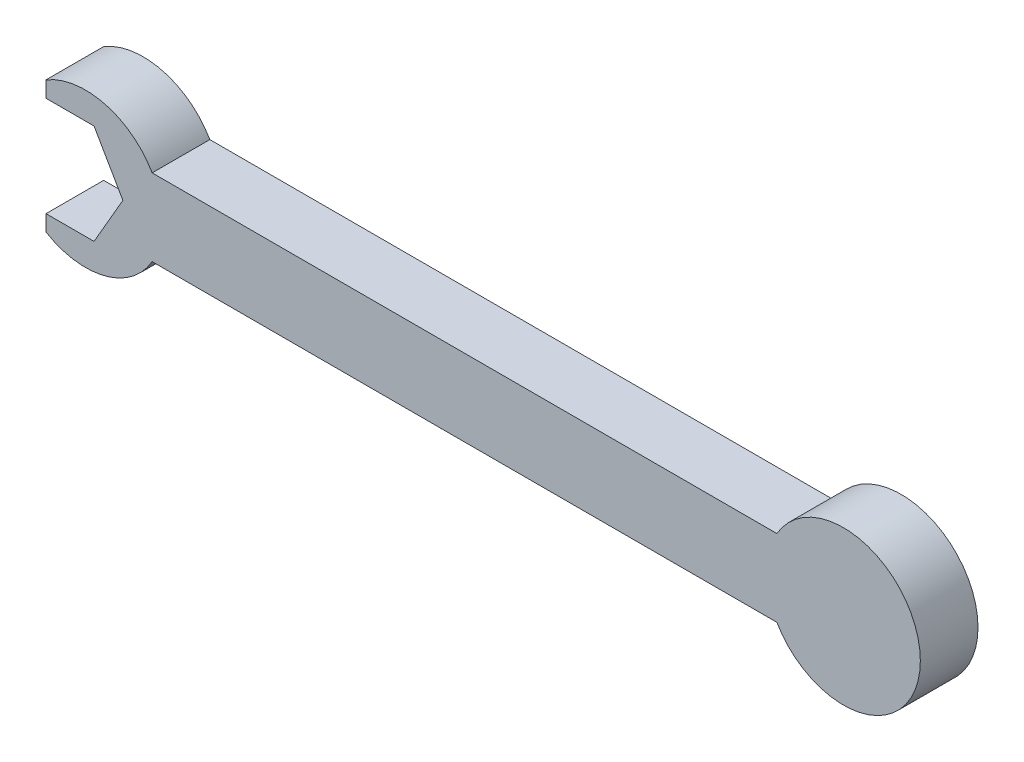
ISO-10303-21;
HEADER;
FILE_DESCRIPTION(('STEP AP214'),'2;1');
FILE_NAME('part.step','',(''),(''),'','','');
FILE_SCHEMA(('AUTOMOTIVE_DESIGN { 1 0 10303 214 1 1 1 1 }'));
ENDSEC;
DATA;
#1=APPLICATION_CONTEXT('core data for automotive mechanical design processes');
#2=APPLICATION_PROTOCOL_DEFINITION('international standard','automotive_design',2000,#1);
#3=PRODUCT_CONTEXT('',#1,'mechanical');
#4=PRODUCT('Part','Part','',(#3));
#5=PRODUCT_RELATED_PRODUCT_CATEGORY('part','',(#4));
#6=PRODUCT_DEFINITION_FORMATION('','',#4);
#7=PRODUCT_DEFINITION_CONTEXT('part definition',#1,'design');
#8=PRODUCT_DEFINITION('design','',#6,#7);
#9=PRODUCT_DEFINITION_SHAPE('','',#8);
#10=(LENGTH_UNIT() NAMED_UNIT(*) SI_UNIT(.MILLI.,.METRE.));
#11=(NAMED_UNIT(*) PLANE_ANGLE_UNIT() SI_UNIT($,.RADIAN.));
#12=(NAMED_UNIT(*) SI_UNIT($,.STERADIAN.) SOLID_ANGLE_UNIT());
#13=UNCERTAINTY_MEASURE_WITH_UNIT(LENGTH_MEASURE(1.E-05),#10,'distance_accuracy_value','');
#14=(GEOMETRIC_REPRESENTATION_CONTEXT(3) GLOBAL_UNCERTAINTY_ASSIGNED_CONTEXT((#13)) GLOBAL_UNIT_ASSIGNED_CONTEXT((#10,
#11,#12)) REPRESENTATION_CONTEXT('',''));
#15=CARTESIAN_POINT('',(0.,0.,0.));
#16=DIRECTION('',(0.,0.,1.));
#17=DIRECTION('',(1.,0.,0.));
#18=AXIS2_PLACEMENT_3D('',#15,#16,#17);
#19=CARTESIAN_POINT('',(0.,0.,3.81));
#20=DIRECTION('',(0.,0.,-1.));
#21=DIRECTION('',(-1.,0.,0.));
#22=AXIS2_PLACEMENT_3D('',#19,#20,#21);
#23=CYLINDRICAL_SURFACE('',#22,10.16);
#24=DIRECTION('',(0.,0.,1.));
#25=VECTOR('',#24,1.);
#26=CARTESIAN_POINT('',(-5.2310529809468,-8.70986134852488,-3.81));
#27=LINE('',#26,#25);
#28=CARTESIAN_POINT('',(-5.2310529809468,-8.70986134852488,-3.81));
#29=VERTEX_POINT('',#28);
#30=CARTESIAN_POINT('',(-5.2310529809468,-8.70986134852488,3.81));
#31=VERTEX_POINT('',#30);
#32=EDGE_CURVE('E150',#29,#31,#27,.T.);
#33=ORIENTED_EDGE('',*,*,#32,.F.);
#34=CARTESIAN_POINT('',(0.,0.,-3.81));
#35=DIRECTION('',(0.,0.,1.));
#36=DIRECTION('',(1.,0.,0.));
#37=AXIS2_PLACEMENT_3D('',#34,#35,#36);
#38=CIRCLE('',#37,10.16);
#39=CARTESIAN_POINT('',(8.7988181024499,-5.08,-3.81));
#40=VERTEX_POINT('',#39);
#41=EDGE_CURVE('E164',#29,#40,#38,.T.);
#42=ORIENTED_EDGE('',*,*,#41,.T.);
#43=DIRECTION('',(0.,0.,-1.));
#44=VECTOR('',#43,1.);
#45=CARTESIAN_POINT('',(8.7988181024499,-5.08,3.81));
#46=LINE('',#45,#44);
#47=CARTESIAN_POINT('',(8.7988181024499,-5.08,3.81));
#48=VERTEX_POINT('',#47);
#49=EDGE_CURVE('E11',#48,#40,#46,.T.);
#50=ORIENTED_EDGE('',*,*,#49,.F.);
#51=CARTESIAN_POINT('',(0.,0.,3.81));
#52=DIRECTION('',(0.,0.,1.));
#53=DIRECTION('',(1.,0.,0.));
#54=AXIS2_PLACEMENT_3D('',#51,#52,#53);
#55=CIRCLE('',#54,10.16);
#56=EDGE_CURVE('E93',#31,#48,#55,.T.);
#57=ORIENTED_EDGE('',*,*,#56,.F.);
#58=EDGE_LOOP('',(#33,#42,#50,#57));
#59=FACE_BOUND('',#58,.T.);
#60=ADVANCED_FACE('F43',(#59),#23,.T.);
#61=CARTESIAN_POINT('',(0.,0.,3.81));
#62=DIRECTION('',(0.,0.,1.));
#63=DIRECTION('',(1.,0.,0.));
#64=AXIS2_PLACEMENT_3D('',#61,#62,#63);
#65=PLANE('',#64);
#66=CARTESIAN_POINT('',(8.7988181024499,5.08,3.81));
#67=VERTEX_POINT('',#66);
#68=CARTESIAN_POINT('',(-5.2310529809468,8.70986134852488,3.81));
#69=VERTEX_POINT('',#68);
#70=EDGE_CURVE('E148',#67,#69,#55,.T.);
#71=ORIENTED_EDGE('',*,*,#70,.T.);
#72=DIRECTION('',(0.,-1.,0.));
#73=VECTOR('',#72,1.);
#74=CARTESIAN_POINT('',(-5.2310529809468,0.,3.81));
#75=LINE('',#74,#73);
#76=CARTESIAN_POINT('',(-5.2310529809468,6.59911357683742,3.81));
#77=VERTEX_POINT('',#76);
#78=EDGE_CURVE('E132',#69,#77,#75,.T.);
#79=ORIENTED_EDGE('',*,*,#78,.T.);
#80=DIRECTION('',(-1.,0.,0.));
#81=VECTOR('',#80,1.);
#82=CARTESIAN_POINT('',(0.,6.59911357683742,3.81));
#83=LINE('',#82,#81);
#84=CARTESIAN_POINT('',(1.1189470190532,6.59911357683742,3.81));
#85=VERTEX_POINT('',#84);
#86=EDGE_CURVE('E232',#85,#77,#83,.T.);
#87=ORIENTED_EDGE('',*,*,#86,.F.);
#88=DIRECTION('',(-0.5,0.866025403784439,0.));
#89=VECTOR('',#88,1.);
#90=CARTESIAN_POINT('',(3.6967102642899,2.13429666620382,3.81));
#91=LINE('',#90,#89);
#92=CARTESIAN_POINT('',(4.9289470190532,0.,3.81));
#93=VERTEX_POINT('',#92);
#94=EDGE_CURVE('E269',#93,#85,#91,.T.);
#95=ORIENTED_EDGE('',*,*,#94,.F.);
#96=DIRECTION('',(0.500000000000001,0.866025403784438,0.));
#97=VECTOR('',#96,1.);
#98=CARTESIAN_POINT('',(3.6967102642899,-2.13429666620383,3.81));
#99=LINE('',#98,#97);
#100=CARTESIAN_POINT('',(1.1189470190532,-6.59911357683742,3.81));
#101=VERTEX_POINT('',#100);
#102=EDGE_CURVE('E272',#101,#93,#99,.T.);
#103=ORIENTED_EDGE('',*,*,#102,.F.);
#104=DIRECTION('',(1.,0.,0.));
#105=VECTOR('',#104,1.);
#106=CARTESIAN_POINT('',(0.,-6.59911357683742,3.81));
#107=LINE('',#106,#105);
#108=CARTESIAN_POINT('',(-5.2310529809468,-6.59911357683742,3.81));
#109=VERTEX_POINT('',#108);
#110=EDGE_CURVE('E259',#109,#101,#107,.T.);
#111=ORIENTED_EDGE('',*,*,#110,.F.);
#112=DIRECTION('',(0.,-1.,0.));
#113=VECTOR('',#112,1.);
#114=CARTESIAN_POINT('',(-5.2310529809468,0.,3.81));
#115=LINE('',#114,#113);
#116=EDGE_CURVE('E144',#109,#31,#115,.T.);
#117=ORIENTED_EDGE('',*,*,#116,.T.);
#118=ORIENTED_EDGE('',*,*,#56,.T.);
#119=DIRECTION('',(1.,0.,0.));
#120=VECTOR('',#119,1.);
#121=CARTESIAN_POINT('',(0.,-5.08,3.81));
#122=LINE('',#121,#120);
#123=CARTESIAN_POINT('',(91.3488181024499,-5.08,3.81));
#124=VERTEX_POINT('',#123);
#125=EDGE_CURVE('E152',#48,#124,#122,.T.);
#126=ORIENTED_EDGE('',*,*,#125,.T.);
#127=CARTESIAN_POINT('',(100.1476362049,0.,3.81));
#128=DIRECTION('',(0.,0.,1.));
#129=DIRECTION('',(1.,0.,0.));
#130=AXIS2_PLACEMENT_3D('',#127,#128,#129);
#131=CIRCLE('',#130,10.16);
#132=CARTESIAN_POINT('',(91.3488181024499,5.08,3.81));
#133=VERTEX_POINT('',#132);
#134=EDGE_CURVE('E156',#124,#133,#131,.T.);
#135=ORIENTED_EDGE('',*,*,#134,.T.);
#136=DIRECTION('',(1.,0.,0.));
#137=VECTOR('',#136,1.);
#138=CARTESIAN_POINT('',(0.,5.08,3.81));
#139=LINE('',#138,#137);
#140=EDGE_CURVE('E151',#67,#133,#139,.T.);
#141=ORIENTED_EDGE('',*,*,#140,.F.);
#142=EDGE_LOOP('',(#71,#79,#87,#95,#103,#111,#117,#118,#126,#135,#141));
#143=FACE_BOUND('',#142,.T.);
#144=ADVANCED_FACE('F155',(#143),#65,.T.);
#145=CARTESIAN_POINT('',(0.,0.,-3.81));
#146=DIRECTION('',(0.,0.,1.));
#147=DIRECTION('',(1.,0.,0.));
#148=AXIS2_PLACEMENT_3D('',#145,#146,#147);
#149=PLANE('',#148);
#150=DIRECTION('',(0.,-1.,0.));
#151=VECTOR('',#150,1.);
#152=CARTESIAN_POINT('',(-5.2310529809468,0.,-3.81));
#153=LINE('',#152,#151);
#154=CARTESIAN_POINT('',(-5.2310529809468,8.70986134852488,-3.81));
#155=VERTEX_POINT('',#154);
#156=CARTESIAN_POINT('',(-5.2310529809468,6.59911357683742,-3.81));
#157=VERTEX_POINT('',#156);
#158=EDGE_CURVE('E238',#155,#157,#153,.T.);
#159=ORIENTED_EDGE('',*,*,#158,.F.);
#160=CARTESIAN_POINT('',(8.7988181024499,5.08,-3.81));
#161=VERTEX_POINT('',#160);
#162=EDGE_CURVE('E147',#161,#155,#38,.T.);
#163=ORIENTED_EDGE('',*,*,#162,.F.);
#164=DIRECTION('',(1.,0.,0.));
#165=VECTOR('',#164,1.);
#166=CARTESIAN_POINT('',(0.,5.08,-3.81));
#167=LINE('',#166,#165);
#168=CARTESIAN_POINT('',(91.3488181024499,5.08,-3.81));
#169=VERTEX_POINT('',#168);
#170=EDGE_CURVE('E159',#161,#169,#167,.T.);
#171=ORIENTED_EDGE('',*,*,#170,.T.);
#172=CARTESIAN_POINT('',(100.1476362049,0.,-3.81));
#173=DIRECTION('',(0.,0.,1.));
#174=DIRECTION('',(1.,0.,0.));
#175=AXIS2_PLACEMENT_3D('',#172,#173,#174);
#176=CIRCLE('',#175,10.16);
#177=CARTESIAN_POINT('',(91.3488181024499,-5.08,-3.81));
#178=VERTEX_POINT('',#177);
#179=EDGE_CURVE('E170',#178,#169,#176,.T.);
#180=ORIENTED_EDGE('',*,*,#179,.F.);
#181=DIRECTION('',(1.,0.,0.));
#182=VECTOR('',#181,1.);
#183=CARTESIAN_POINT('',(0.,-5.08,-3.81));
#184=LINE('',#183,#182);
#185=EDGE_CURVE('E165',#40,#178,#184,.T.);
#186=ORIENTED_EDGE('',*,*,#185,.F.);
#187=ORIENTED_EDGE('',*,*,#41,.F.);
#188=DIRECTION('',(0.,-1.,0.));
#189=VECTOR('',#188,1.);
#190=CARTESIAN_POINT('',(-5.2310529809468,0.,-3.81));
#191=LINE('',#190,#189);
#192=CARTESIAN_POINT('',(-5.2310529809468,-6.59911357683742,-3.81));
#193=VERTEX_POINT('',#192);
#194=EDGE_CURVE('E251',#193,#29,#191,.T.);
#195=ORIENTED_EDGE('',*,*,#194,.F.);
#196=DIRECTION('',(1.,0.,0.));
#197=VECTOR('',#196,1.);
#198=CARTESIAN_POINT('',(0.,-6.59911357683742,-3.81));
#199=LINE('',#198,#197);
#200=CARTESIAN_POINT('',(1.1189470190532,-6.59911357683742,-3.81));
#201=VERTEX_POINT('',#200);
#202=EDGE_CURVE('E265',#193,#201,#199,.T.);
#203=ORIENTED_EDGE('',*,*,#202,.T.);
#204=DIRECTION('',(0.500000000000001,0.866025403784438,0.));
#205=VECTOR('',#204,1.);
#206=CARTESIAN_POINT('',(3.6967102642899,-2.13429666620383,-3.81));
#207=LINE('',#206,#205);
#208=CARTESIAN_POINT('',(4.9289470190532,0.,-3.81));
#209=VERTEX_POINT('',#208);
#210=EDGE_CURVE('E59',#201,#209,#207,.T.);
#211=ORIENTED_EDGE('',*,*,#210,.T.);
#212=DIRECTION('',(-0.5,0.866025403784439,0.));
#213=VECTOR('',#212,1.);
#214=CARTESIAN_POINT('',(3.6967102642899,2.13429666620382,-3.81));
#215=LINE('',#214,#213);
#216=CARTESIAN_POINT('',(1.1189470190532,6.59911357683742,-3.81));
#217=VERTEX_POINT('',#216);
#218=EDGE_CURVE('E239',#209,#217,#215,.T.);
#219=ORIENTED_EDGE('',*,*,#218,.T.);
#220=DIRECTION('',(-1.,0.,0.));
#221=VECTOR('',#220,1.);
#222=CARTESIAN_POINT('',(0.,6.59911357683742,-3.81));
#223=LINE('',#222,#221);
#224=EDGE_CURVE('E146',#217,#157,#223,.T.);
#225=ORIENTED_EDGE('',*,*,#224,.T.);
#226=EDGE_LOOP('',(#159,#163,#171,#180,#186,#187,#195,#203,#211,#219,#225));
#227=FACE_BOUND('',#226,.T.);
#228=ADVANCED_FACE('F183',(#227),#149,.F.);
#229=ORIENTED_EDGE('',*,*,#162,.T.);
#230=DIRECTION('',(0.,0.,1.));
#231=VECTOR('',#230,1.);
#232=CARTESIAN_POINT('',(-5.2310529809468,8.70986134852488,-3.81));
#233=LINE('',#232,#231);
#234=EDGE_CURVE('E137',#155,#69,#233,.T.);
#235=ORIENTED_EDGE('',*,*,#234,.T.);
#236=ORIENTED_EDGE('',*,*,#70,.F.);
#237=DIRECTION('',(0.,0.,-1.));
#238=VECTOR('',#237,1.);
#239=CARTESIAN_POINT('',(8.7988181024499,5.08,3.81));
#240=LINE('',#239,#238);
#241=EDGE_CURVE('E70',#67,#161,#240,.T.);
#242=ORIENTED_EDGE('',*,*,#241,.T.);
#243=EDGE_LOOP('',(#229,#235,#236,#242));
#244=FACE_BOUND('',#243,.T.);
#245=ADVANCED_FACE('F44',(#244),#23,.T.);
#246=CARTESIAN_POINT('',(0.,-5.08,3.81));
#247=DIRECTION('',(0.,1.,0.));
#248=DIRECTION('',(0.,0.,1.));
#249=AXIS2_PLACEMENT_3D('',#246,#247,#248);
#250=PLANE('',#249);
#251=ORIENTED_EDGE('',*,*,#185,.T.);
#252=DIRECTION('',(0.,0.,-1.));
#253=VECTOR('',#252,1.);
#254=CARTESIAN_POINT('',(91.3488181024499,-5.08,3.81));
#255=LINE('',#254,#253);
#256=EDGE_CURVE('E51',#124,#178,#255,.T.);
#257=ORIENTED_EDGE('',*,*,#256,.F.);
#258=ORIENTED_EDGE('',*,*,#125,.F.);
#259=ORIENTED_EDGE('',*,*,#49,.T.);
#260=EDGE_LOOP('',(#251,#257,#258,#259));
#261=FACE_BOUND('',#260,.T.);
#262=ADVANCED_FACE('F198',(#261),#250,.F.);
#263=CARTESIAN_POINT('',(100.1476362049,0.,3.81));
#264=DIRECTION('',(0.,0.,-1.));
#265=DIRECTION('',(-1.,0.,0.));
#266=AXIS2_PLACEMENT_3D('',#263,#264,#265);
#267=CYLINDRICAL_SURFACE('',#266,10.16);
#268=ORIENTED_EDGE('',*,*,#179,.T.);
#269=DIRECTION('',(0.,0.,-1.));
#270=VECTOR('',#269,1.);
#271=CARTESIAN_POINT('',(91.3488181024499,5.08,3.81));
#272=LINE('',#271,#270);
#273=EDGE_CURVE('E173',#133,#169,#272,.T.);
#274=ORIENTED_EDGE('',*,*,#273,.F.);
#275=ORIENTED_EDGE('',*,*,#134,.F.);
#276=ORIENTED_EDGE('',*,*,#256,.T.);
#277=EDGE_LOOP('',(#268,#274,#275,#276));
#278=FACE_BOUND('',#277,.T.);
#279=ADVANCED_FACE('F177',(#278),#267,.T.);
#280=CARTESIAN_POINT('',(0.,5.08,3.81));
#281=DIRECTION('',(0.,1.,0.));
#282=DIRECTION('',(0.,0.,1.));
#283=AXIS2_PLACEMENT_3D('',#280,#281,#282);
#284=PLANE('',#283);
#285=ORIENTED_EDGE('',*,*,#170,.F.);
#286=ORIENTED_EDGE('',*,*,#241,.F.);
#287=ORIENTED_EDGE('',*,*,#140,.T.);
#288=ORIENTED_EDGE('',*,*,#273,.T.);
#289=EDGE_LOOP('',(#285,#286,#287,#288));
#290=FACE_BOUND('',#289,.T.);
#291=ADVANCED_FACE('F187',(#290),#284,.T.);
#292=CARTESIAN_POINT('',(-5.2310529809468,0.,-3.81));
#293=DIRECTION('',(-1.,0.,0.));
#294=DIRECTION('',(0.,0.,1.));
#295=AXIS2_PLACEMENT_3D('',#292,#293,#294);
#296=PLANE('',#295);
#297=ORIENTED_EDGE('',*,*,#234,.F.);
#298=ORIENTED_EDGE('',*,*,#158,.T.);
#299=DIRECTION('',(0.,0.,1.));
#300=VECTOR('',#299,1.);
#301=CARTESIAN_POINT('',(-5.2310529809468,6.59911357683742,-3.81));
#302=LINE('',#301,#300);
#303=EDGE_CURVE('E140',#157,#77,#302,.T.);
#304=ORIENTED_EDGE('',*,*,#303,.T.);
#305=ORIENTED_EDGE('',*,*,#78,.F.);
#306=EDGE_LOOP('',(#297,#298,#304,#305));
#307=FACE_BOUND('',#306,.T.);
#308=ADVANCED_FACE('F136',(#307),#296,.T.);
#309=CARTESIAN_POINT('',(0.,6.59911357683742,-3.81));
#310=DIRECTION('',(0.,1.,0.));
#311=DIRECTION('',(0.,0.,1.));
#312=AXIS2_PLACEMENT_3D('',#309,#310,#311);
#313=PLANE('',#312);
#314=ORIENTED_EDGE('',*,*,#303,.F.);
#315=ORIENTED_EDGE('',*,*,#224,.F.);
#316=DIRECTION('',(0.,0.,1.));
#317=VECTOR('',#316,1.);
#318=CARTESIAN_POINT('',(1.1189470190532,6.59911357683742,-3.81));
#319=LINE('',#318,#317);
#320=EDGE_CURVE('E236',#217,#85,#319,.T.);
#321=ORIENTED_EDGE('',*,*,#320,.T.);
#322=ORIENTED_EDGE('',*,*,#86,.T.);
#323=EDGE_LOOP('',(#314,#315,#321,#322));
#324=FACE_BOUND('',#323,.T.);
#325=ADVANCED_FACE('F195',(#324),#313,.F.);
#326=CARTESIAN_POINT('',(3.6967102642899,2.13429666620382,-3.81));
#327=DIRECTION('',(0.866025403784439,0.5,0.));
#328=DIRECTION('',(-0.5,0.866025403784439,0.));
#329=AXIS2_PLACEMENT_3D('',#326,#327,#328);
#330=PLANE('',#329);
#331=ORIENTED_EDGE('',*,*,#320,.F.);
#332=ORIENTED_EDGE('',*,*,#218,.F.);
#333=DIRECTION('',(0.,0.,1.));
#334=VECTOR('',#333,1.);
#335=CARTESIAN_POINT('',(4.9289470190532,0.,-3.81));
#336=LINE('',#335,#334);
#337=EDGE_CURVE('E246',#209,#93,#336,.T.);
#338=ORIENTED_EDGE('',*,*,#337,.T.);
#339=ORIENTED_EDGE('',*,*,#94,.T.);
#340=EDGE_LOOP('',(#331,#332,#338,#339));
#341=FACE_BOUND('',#340,.T.);
#342=ADVANCED_FACE('F223',(#341),#330,.F.);
#343=CARTESIAN_POINT('',(3.6967102642899,-2.13429666620383,-3.81));
#344=DIRECTION('',(0.866025403784438,-0.500000000000001,0.));
#345=DIRECTION('',(0.500000000000001,0.866025403784438,0.));
#346=AXIS2_PLACEMENT_3D('',#343,#344,#345);
#347=PLANE('',#346);
#348=ORIENTED_EDGE('',*,*,#337,.F.);
#349=ORIENTED_EDGE('',*,*,#210,.F.);
#350=DIRECTION('',(0.,0.,1.));
#351=VECTOR('',#350,1.);
#352=CARTESIAN_POINT('',(1.1189470190532,-6.59911357683742,-3.81));
#353=LINE('',#352,#351);
#354=EDGE_CURVE('E247',#201,#101,#353,.T.);
#355=ORIENTED_EDGE('',*,*,#354,.T.);
#356=ORIENTED_EDGE('',*,*,#102,.T.);
#357=EDGE_LOOP('',(#348,#349,#355,#356));
#358=FACE_BOUND('',#357,.T.);
#359=ADVANCED_FACE('F219',(#358),#347,.F.);
#360=CARTESIAN_POINT('',(0.,-6.59911357683742,-3.81));
#361=DIRECTION('',(0.,-1.,0.));
#362=DIRECTION('',(1.,0.,0.));
#363=AXIS2_PLACEMENT_3D('',#360,#361,#362);
#364=PLANE('',#363);
#365=ORIENTED_EDGE('',*,*,#354,.F.);
#366=ORIENTED_EDGE('',*,*,#202,.F.);
#367=DIRECTION('',(0.,0.,1.));
#368=VECTOR('',#367,1.);
#369=CARTESIAN_POINT('',(-5.2310529809468,-6.59911357683742,-3.81));
#370=LINE('',#369,#368);
#371=EDGE_CURVE('E249',#193,#109,#370,.T.);
#372=ORIENTED_EDGE('',*,*,#371,.T.);
#373=ORIENTED_EDGE('',*,*,#110,.T.);
#374=EDGE_LOOP('',(#365,#366,#372,#373));
#375=FACE_BOUND('',#374,.T.);
#376=ADVANCED_FACE('F218',(#375),#364,.F.);
#377=CARTESIAN_POINT('',(-5.2310529809468,0.,-3.81));
#378=DIRECTION('',(-1.,0.,0.));
#379=DIRECTION('',(0.,0.,1.));
#380=AXIS2_PLACEMENT_3D('',#377,#378,#379);
#381=PLANE('',#380);
#382=ORIENTED_EDGE('',*,*,#371,.F.);
#383=ORIENTED_EDGE('',*,*,#194,.T.);
#384=ORIENTED_EDGE('',*,*,#32,.T.);
#385=ORIENTED_EDGE('',*,*,#116,.F.);
#386=EDGE_LOOP('',(#382,#383,#384,#385));
#387=FACE_BOUND('',#386,.T.);
#388=ADVANCED_FACE('F212',(#387),#381,.T.);
#389=CLOSED_SHELL('',(#60,#144,#228,#245,#262,#279,#291,#308,#325,#342,#359,#376,#388));
#390=MANIFOLD_SOLID_BREP('B2',#389);
#391=ADVANCED_BREP_SHAPE_REPRESENTATION('',(#18,#390),#14);
#392=SHAPE_DEFINITION_REPRESENTATION(#9,#391);
ENDSEC;
END-ISO-10303-21;
